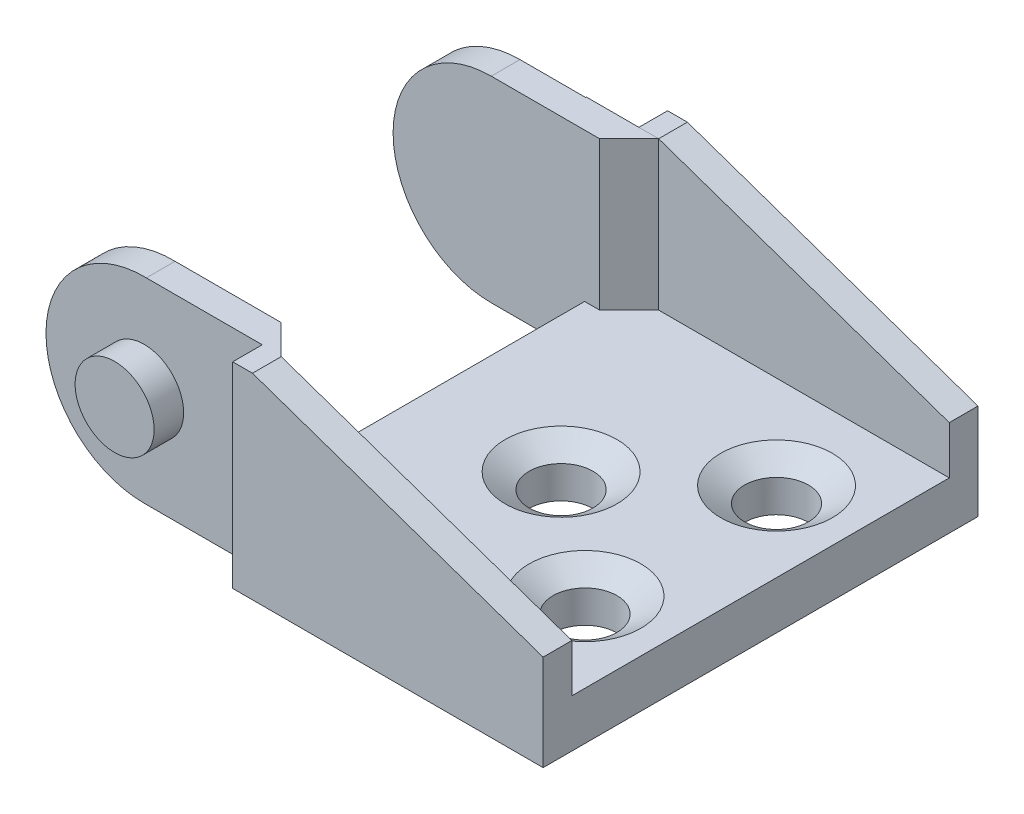
ISO-10303-21;
HEADER;
FILE_DESCRIPTION(('STEP AP214'),'2;1');
FILE_NAME('part.step','',(''),(''),'','','');
FILE_SCHEMA(('AUTOMOTIVE_DESIGN { 1 0 10303 214 1 1 1 1 }'));
ENDSEC;
DATA;
#1=APPLICATION_CONTEXT('core data for automotive mechanical design processes');
#2=APPLICATION_PROTOCOL_DEFINITION('international standard','automotive_design',2000,#1);
#3=PRODUCT_CONTEXT('',#1,'mechanical');
#4=PRODUCT('Part','Part','',(#3));
#5=PRODUCT_RELATED_PRODUCT_CATEGORY('part','',(#4));
#6=PRODUCT_DEFINITION_FORMATION('','',#4);
#7=PRODUCT_DEFINITION_CONTEXT('part definition',#1,'design');
#8=PRODUCT_DEFINITION('design','',#6,#7);
#9=PRODUCT_DEFINITION_SHAPE('','',#8);
#10=(LENGTH_UNIT() NAMED_UNIT(*) SI_UNIT(.MILLI.,.METRE.));
#11=(NAMED_UNIT(*) PLANE_ANGLE_UNIT() SI_UNIT($,.RADIAN.));
#12=(NAMED_UNIT(*) SI_UNIT($,.STERADIAN.) SOLID_ANGLE_UNIT());
#13=UNCERTAINTY_MEASURE_WITH_UNIT(LENGTH_MEASURE(1.E-05),#10,'distance_accuracy_value','');
#14=(GEOMETRIC_REPRESENTATION_CONTEXT(3) GLOBAL_UNCERTAINTY_ASSIGNED_CONTEXT((#13)) GLOBAL_UNIT_ASSIGNED_CONTEXT((#10,
#11,#12)) REPRESENTATION_CONTEXT('',''));
#15=CARTESIAN_POINT('',(0.,0.,0.));
#16=DIRECTION('',(0.,0.,1.));
#17=DIRECTION('',(1.,0.,0.));
#18=AXIS2_PLACEMENT_3D('',#15,#16,#17);
#19=CARTESIAN_POINT('',(6.15,6.15,-27.25));
#20=DIRECTION('',(0.,0.,1.));
#21=DIRECTION('',(1.,0.,0.));
#22=AXIS2_PLACEMENT_3D('',#19,#20,#21);
#23=CYLINDRICAL_SURFACE('',#22,6.15);
#24=DIRECTION('',(0.,0.,1.));
#25=VECTOR('',#24,1.);
#26=CARTESIAN_POINT('',(6.15,0.,-27.25));
#27=LINE('',#26,#25);
#28=CARTESIAN_POINT('',(6.15,0.,-3.65));
#29=VERTEX_POINT('',#28);
#30=CARTESIAN_POINT('',(6.15,0.,-1.85));
#31=VERTEX_POINT('',#30);
#32=EDGE_CURVE('E312',#29,#31,#27,.T.);
#33=ORIENTED_EDGE('',*,*,#32,.T.);
#34=CARTESIAN_POINT('',(6.15,6.15,-1.85));
#35=DIRECTION('',(0.,0.,1.));
#36=DIRECTION('',(1.,0.,0.));
#37=AXIS2_PLACEMENT_3D('',#34,#35,#36);
#38=CIRCLE('',#37,6.15);
#39=CARTESIAN_POINT('',(6.289600468625,12.298415381963,-1.85));
#40=VERTEX_POINT('',#39);
#41=EDGE_CURVE('E392',#31,#40,#38,.F.);
#42=ORIENTED_EDGE('',*,*,#41,.T.);
#43=DIRECTION('',(0.,0.,1.));
#44=VECTOR('',#43,1.);
#45=CARTESIAN_POINT('',(6.289600468625,12.298415381963,-27.25));
#46=LINE('',#45,#44);
#47=CARTESIAN_POINT('',(6.289600468625,12.298415381963,-3.65));
#48=VERTEX_POINT('',#47);
#49=EDGE_CURVE('E197',#48,#40,#46,.T.);
#50=ORIENTED_EDGE('',*,*,#49,.F.);
#51=CARTESIAN_POINT('',(6.15,6.15,-3.65));
#52=DIRECTION('',(0.,0.,-1.));
#53=DIRECTION('',(0.,1.,0.));
#54=AXIS2_PLACEMENT_3D('',#51,#52,#53);
#55=CIRCLE('',#54,6.15);
#56=EDGE_CURVE('E261',#29,#48,#55,.T.);
#57=ORIENTED_EDGE('',*,*,#56,.F.);
#58=EDGE_LOOP('',(#33,#42,#50,#57));
#59=FACE_BOUND('',#58,.T.);
#60=ADVANCED_FACE('F42',(#59),#23,.T.);
#61=DIRECTION('',(0.,0.,-1.));
#62=VECTOR('',#61,1.);
#63=CARTESIAN_POINT('',(6.15,12.3,-23.6));
#64=LINE('',#63,#62);
#65=CARTESIAN_POINT('',(6.15,12.3,-23.6));
#66=VERTEX_POINT('',#65);
#67=CARTESIAN_POINT('',(6.15,12.3,-25.4));
#68=VERTEX_POINT('',#67);
#69=EDGE_CURVE('E282',#66,#68,#64,.T.);
#70=ORIENTED_EDGE('',*,*,#69,.T.);
#71=CARTESIAN_POINT('',(6.15,6.15,-25.4));
#72=DIRECTION('',(0.,0.,-1.));
#73=DIRECTION('',(-1.,0.,0.));
#74=AXIS2_PLACEMENT_3D('',#71,#72,#73);
#75=CIRCLE('',#74,6.15);
#76=CARTESIAN_POINT('',(6.15,0.,-25.4));
#77=VERTEX_POINT('',#76);
#78=EDGE_CURVE('E245',#68,#77,#75,.F.);
#79=ORIENTED_EDGE('',*,*,#78,.T.);
#80=CARTESIAN_POINT('',(6.15,0.,-23.6));
#81=VERTEX_POINT('',#80);
#82=EDGE_CURVE('E325',#77,#81,#27,.T.);
#83=ORIENTED_EDGE('',*,*,#82,.T.);
#84=CARTESIAN_POINT('',(6.15,6.15,-23.6));
#85=DIRECTION('',(0.,0.,1.));
#86=DIRECTION('',(1.,0.,0.));
#87=AXIS2_PLACEMENT_3D('',#84,#85,#86);
#88=CIRCLE('',#87,6.15);
#89=EDGE_CURVE('E275',#66,#81,#88,.T.);
#90=ORIENTED_EDGE('',*,*,#89,.F.);
#91=EDGE_LOOP('',(#70,#79,#83,#90));
#92=FACE_BOUND('',#91,.T.);
#93=ADVANCED_FACE('F445',(#92),#23,.T.);
#94=CARTESIAN_POINT('',(33.,3.,-25.45));
#95=DIRECTION('',(0.,-1.,0.));
#96=DIRECTION('',(0.,0.,-1.));
#97=AXIS2_PLACEMENT_3D('',#94,#95,#96);
#98=PLANE('',#97);
#99=CARTESIAN_POINT('',(28.,3.,-7.625));
#100=DIRECTION('',(0.,-1.,0.));
#101=DIRECTION('',(0.,0.,-1.));
#102=AXIS2_PLACEMENT_3D('',#99,#100,#101);
#103=CIRCLE('',#102,3.5);
#104=CARTESIAN_POINT('',(28.,3.,-11.125));
#105=VERTEX_POINT('',#104);
#106=EDGE_CURVE('E372',#105,#105,#103,.T.);
#107=ORIENTED_EDGE('',*,*,#106,.T.);
#108=EDGE_LOOP('',(#107));
#109=FACE_BOUND('',#108,.T.);
#110=CARTESIAN_POINT('',(28.,3.,-19.625));
#111=DIRECTION('',(0.,-1.,0.));
#112=DIRECTION('',(0.,0.,-1.));
#113=AXIS2_PLACEMENT_3D('',#110,#111,#112);
#114=CIRCLE('',#113,3.5);
#115=CARTESIAN_POINT('',(28.,3.,-23.125));
#116=VERTEX_POINT('',#115);
#117=EDGE_CURVE('E369',#116,#116,#114,.T.);
#118=ORIENTED_EDGE('',*,*,#117,.T.);
#119=EDGE_LOOP('',(#118));
#120=FACE_BOUND('',#119,.T.);
#121=CARTESIAN_POINT('',(20.5,3.,-13.625));
#122=DIRECTION('',(0.,-1.,0.));
#123=DIRECTION('',(0.,0.,-1.));
#124=AXIS2_PLACEMENT_3D('',#121,#122,#123);
#125=CIRCLE('',#124,3.50000000000001);
#126=CARTESIAN_POINT('',(20.5,3.,-17.125));
#127=VERTEX_POINT('',#126);
#128=EDGE_CURVE('E366',#127,#127,#125,.T.);
#129=ORIENTED_EDGE('',*,*,#128,.T.);
#130=EDGE_LOOP('',(#129));
#131=FACE_BOUND('',#130,.T.);
#132=DIRECTION('',(1.,0.,0.));
#133=VECTOR('',#132,1.);
#134=CARTESIAN_POINT('',(33.,3.,-3.65));
#135=LINE('',#134,#133);
#136=CARTESIAN_POINT('',(12.,3.,-3.65));
#137=VERTEX_POINT('',#136);
#138=CARTESIAN_POINT('',(12.939600468625,3.,-3.65));
#139=VERTEX_POINT('',#138);
#140=EDGE_CURVE('E267',#137,#139,#135,.T.);
#141=ORIENTED_EDGE('',*,*,#140,.T.);
#142=DIRECTION('',(0.707106781186545,0.,0.70710678118655));
#143=VECTOR('',#142,1.);
#144=CARTESIAN_POINT('',(12.0698002343124,3.,-4.51980023431259));
#145=LINE('',#144,#143);
#146=CARTESIAN_POINT('',(14.789600468625,3.,-1.8));
#147=VERTEX_POINT('',#146);
#148=EDGE_CURVE('E51',#139,#147,#145,.T.);
#149=ORIENTED_EDGE('',*,*,#148,.T.);
#150=DIRECTION('',(-1.,0.,0.));
#151=VECTOR('',#150,1.);
#152=CARTESIAN_POINT('',(33.,3.,-1.8));
#153=LINE('',#152,#151);
#154=CARTESIAN_POINT('',(33.,3.,-1.8));
#155=VERTEX_POINT('',#154);
#156=EDGE_CURVE('E349',#155,#147,#153,.T.);
#157=ORIENTED_EDGE('',*,*,#156,.F.);
#158=DIRECTION('',(0.,0.,1.));
#159=VECTOR('',#158,1.);
#160=CARTESIAN_POINT('',(33.,3.,-25.45));
#161=LINE('',#160,#159);
#162=CARTESIAN_POINT('',(33.,3.,-25.45));
#163=VERTEX_POINT('',#162);
#164=EDGE_CURVE('E344',#163,#155,#161,.T.);
#165=ORIENTED_EDGE('',*,*,#164,.F.);
#166=DIRECTION('',(-1.,0.,0.));
#167=VECTOR('',#166,1.);
#168=CARTESIAN_POINT('',(33.,3.,-25.45));
#169=LINE('',#168,#167);
#170=CARTESIAN_POINT('',(14.789600468625,3.,-25.45));
#171=VERTEX_POINT('',#170);
#172=EDGE_CURVE('E352',#163,#171,#169,.T.);
#173=ORIENTED_EDGE('',*,*,#172,.T.);
#174=DIRECTION('',(-0.707106781186545,0.,0.70710678118655));
#175=VECTOR('',#174,1.);
#176=CARTESIAN_POINT('',(23.8948002343124,3.,-34.5551997656875));
#177=LINE('',#176,#175);
#178=CARTESIAN_POINT('',(12.939600468625,3.,-23.6));
#179=VERTEX_POINT('',#178);
#180=EDGE_CURVE('E12',#171,#179,#177,.T.);
#181=ORIENTED_EDGE('',*,*,#180,.T.);
#182=DIRECTION('',(-1.,0.,0.));
#183=VECTOR('',#182,1.);
#184=CARTESIAN_POINT('',(33.,3.,-23.6));
#185=LINE('',#184,#183);
#186=CARTESIAN_POINT('',(12.,3.,-23.6));
#187=VERTEX_POINT('',#186);
#188=EDGE_CURVE('E288',#179,#187,#185,.T.);
#189=ORIENTED_EDGE('',*,*,#188,.T.);
#190=DIRECTION('',(0.,0.,-1.));
#191=VECTOR('',#190,1.);
#192=CARTESIAN_POINT('',(12.,3.,-25.45));
#193=LINE('',#192,#191);
#194=EDGE_CURVE('E294',#137,#187,#193,.T.);
#195=ORIENTED_EDGE('',*,*,#194,.F.);
#196=EDGE_LOOP('',(#141,#149,#157,#165,#173,#181,#189,#195));
#197=FACE_BOUND('',#196,.T.);
#198=ADVANCED_FACE('F402',(#109,#120,#131,#197),#98,.F.);
#199=CARTESIAN_POINT('',(33.,3.,-1.8));
#200=DIRECTION('',(0.,0.,1.));
#201=DIRECTION('',(0.,-1.,0.));
#202=AXIS2_PLACEMENT_3D('',#199,#200,#201);
#203=PLANE('',#202);
#204=DIRECTION('',(0.,-1.,0.));
#205=VECTOR('',#204,1.);
#206=CARTESIAN_POINT('',(14.789600468625,0.,-1.8));
#207=LINE('',#206,#205);
#208=CARTESIAN_POINT('',(14.789600468625,12.3,-1.8));
#209=VERTEX_POINT('',#208);
#210=EDGE_CURVE('E257',#209,#147,#207,.T.);
#211=ORIENTED_EDGE('',*,*,#210,.F.);
#212=DIRECTION('',(-0.945043806505376,0.326943731834439,0.));
#213=VECTOR('',#212,1.);
#214=CARTESIAN_POINT('',(33.9269284465377,5.67932338864251,-1.8));
#215=LINE('',#214,#213);
#216=CARTESIAN_POINT('',(33.,6.,-1.8));
#217=VERTEX_POINT('',#216);
#218=EDGE_CURVE('E317',#217,#209,#215,.T.);
#219=ORIENTED_EDGE('',*,*,#218,.F.);
#220=DIRECTION('',(0.,1.,0.));
#221=VECTOR('',#220,1.);
#222=CARTESIAN_POINT('',(33.,3.,-1.8));
#223=LINE('',#222,#221);
#224=EDGE_CURVE('E346',#155,#217,#223,.T.);
#225=ORIENTED_EDGE('',*,*,#224,.F.);
#226=ORIENTED_EDGE('',*,*,#156,.T.);
#227=EDGE_LOOP('',(#211,#219,#225,#226));
#228=FACE_BOUND('',#227,.T.);
#229=ADVANCED_FACE('F409',(#228),#203,.F.);
#230=CARTESIAN_POINT('',(33.,12.3,-25.45));
#231=DIRECTION('',(0.,0.,-1.));
#232=DIRECTION('',(-1.,0.,0.));
#233=AXIS2_PLACEMENT_3D('',#230,#231,#232);
#234=PLANE('',#233);
#235=DIRECTION('',(0.,1.,0.));
#236=VECTOR('',#235,1.);
#237=CARTESIAN_POINT('',(14.789600468625,12.3,-25.45));
#238=LINE('',#237,#236);
#239=CARTESIAN_POINT('',(14.789600468625,12.3,-25.45));
#240=VERTEX_POINT('',#239);
#241=EDGE_CURVE('E272',#171,#240,#238,.T.);
#242=ORIENTED_EDGE('',*,*,#241,.F.);
#243=ORIENTED_EDGE('',*,*,#172,.F.);
#244=DIRECTION('',(0.,-1.,0.));
#245=VECTOR('',#244,1.);
#246=CARTESIAN_POINT('',(33.,12.3,-25.45));
#247=LINE('',#246,#245);
#248=CARTESIAN_POINT('',(33.,6.,-25.45));
#249=VERTEX_POINT('',#248);
#250=EDGE_CURVE('E342',#249,#163,#247,.T.);
#251=ORIENTED_EDGE('',*,*,#250,.F.);
#252=DIRECTION('',(0.945043806505376,-0.326943731834439,0.));
#253=VECTOR('',#252,1.);
#254=CARTESIAN_POINT('',(31.0534502622709,6.67342088385073,-25.45));
#255=LINE('',#254,#253);
#256=EDGE_CURVE('E329',#240,#249,#255,.T.);
#257=ORIENTED_EDGE('',*,*,#256,.F.);
#258=EDGE_LOOP('',(#242,#243,#251,#257));
#259=FACE_BOUND('',#258,.T.);
#260=ADVANCED_FACE('F479',(#259),#234,.F.);
#261=CARTESIAN_POINT('',(33.,12.3,0.));
#262=DIRECTION('',(0.,0.,-1.));
#263=DIRECTION('',(0.,1.,0.));
#264=AXIS2_PLACEMENT_3D('',#261,#262,#263);
#265=PLANE('',#264);
#266=DIRECTION('',(-0.999999982622739,-0.00018642564816779,0.));
#267=VECTOR('',#266,1.);
#268=CARTESIAN_POINT('',(6.289600468625,12.298415381963,0.));
#269=LINE('',#268,#267);
#270=CARTESIAN_POINT('',(14.789600468625,12.3,0.));
#271=VERTEX_POINT('',#270);
#272=CARTESIAN_POINT('',(13.5500000042183,12.2997689066759,0.));
#273=VERTEX_POINT('',#272);
#274=EDGE_CURVE('E309',#271,#273,#269,.T.);
#275=ORIENTED_EDGE('',*,*,#274,.T.);
#276=DIRECTION('',(0.000102412438478702,0.999999994755846,0.));
#277=VECTOR('',#276,1.);
#278=CARTESIAN_POINT('',(13.5500000042183,12.2997689066759,0.));
#279=LINE('',#278,#277);
#280=CARTESIAN_POINT('',(13.5487403548852,0.,0.));
#281=VERTEX_POINT('',#280);
#282=EDGE_CURVE('E210',#281,#273,#279,.T.);
#283=ORIENTED_EDGE('',*,*,#282,.F.);
#284=DIRECTION('',(-1.,0.,0.));
#285=VECTOR('',#284,1.);
#286=CARTESIAN_POINT('',(33.,0.,0.));
#287=LINE('',#286,#285);
#288=CARTESIAN_POINT('',(33.,0.,0.));
#289=VERTEX_POINT('',#288);
#290=EDGE_CURVE('E357',#289,#281,#287,.T.);
#291=ORIENTED_EDGE('',*,*,#290,.F.);
#292=DIRECTION('',(0.,-1.,0.));
#293=VECTOR('',#292,1.);
#294=CARTESIAN_POINT('',(33.,12.3,0.));
#295=LINE('',#294,#293);
#296=CARTESIAN_POINT('',(33.,6.,0.));
#297=VERTEX_POINT('',#296);
#298=EDGE_CURVE('E335',#297,#289,#295,.T.);
#299=ORIENTED_EDGE('',*,*,#298,.F.);
#300=DIRECTION('',(-0.945043806505376,0.326943731834439,0.));
#301=VECTOR('',#300,1.);
#302=CARTESIAN_POINT('',(14.789600468625,12.3,0.));
#303=LINE('',#302,#301);
#304=EDGE_CURVE('E302',#297,#271,#303,.T.);
#305=ORIENTED_EDGE('',*,*,#304,.T.);
#306=EDGE_LOOP('',(#275,#283,#291,#299,#305));
#307=FACE_BOUND('',#306,.T.);
#308=ADVANCED_FACE('F426',(#307),#265,.F.);
#309=CARTESIAN_POINT('',(33.,0.,0.));
#310=DIRECTION('',(0.,1.,0.));
#311=DIRECTION('',(0.,0.,1.));
#312=AXIS2_PLACEMENT_3D('',#309,#310,#311);
#313=PLANE('',#312);
#314=ORIENTED_EDGE('',*,*,#290,.T.);
#315=DIRECTION('',(0.,0.,1.));
#316=VECTOR('',#315,1.);
#317=CARTESIAN_POINT('',(13.5487403548852,0.,-1.85));
#318=LINE('',#317,#316);
#319=CARTESIAN_POINT('',(13.5487403548852,0.,-1.85));
#320=VERTEX_POINT('',#319);
#321=EDGE_CURVE('E203',#320,#281,#318,.T.);
#322=ORIENTED_EDGE('',*,*,#321,.F.);
#323=DIRECTION('',(1.,0.,0.));
#324=VECTOR('',#323,1.);
#325=CARTESIAN_POINT('',(10.2655194125093,0.,-1.85));
#326=LINE('',#325,#324);
#327=EDGE_CURVE('E211',#31,#320,#326,.T.);
#328=ORIENTED_EDGE('',*,*,#327,.F.);
#329=ORIENTED_EDGE('',*,*,#32,.F.);
#330=DIRECTION('',(-1.,0.,0.));
#331=VECTOR('',#330,1.);
#332=CARTESIAN_POINT('',(6.15,0.,-3.65));
#333=LINE('',#332,#331);
#334=CARTESIAN_POINT('',(12.,0.,-3.65));
#335=VERTEX_POINT('',#334);
#336=EDGE_CURVE('E258',#335,#29,#333,.T.);
#337=ORIENTED_EDGE('',*,*,#336,.F.);
#338=DIRECTION('',(0.,0.,-1.));
#339=VECTOR('',#338,1.);
#340=CARTESIAN_POINT('',(12.,0.,-25.45));
#341=LINE('',#340,#339);
#342=CARTESIAN_POINT('',(12.,0.,-23.6));
#343=VERTEX_POINT('',#342);
#344=EDGE_CURVE('E300',#335,#343,#341,.T.);
#345=ORIENTED_EDGE('',*,*,#344,.T.);
#346=DIRECTION('',(1.,0.,0.));
#347=VECTOR('',#346,1.);
#348=CARTESIAN_POINT('',(14.789600468625,0.,-23.6));
#349=LINE('',#348,#347);
#350=EDGE_CURVE('E279',#81,#343,#349,.T.);
#351=ORIENTED_EDGE('',*,*,#350,.F.);
#352=ORIENTED_EDGE('',*,*,#82,.F.);
#353=DIRECTION('',(-1.,0.,0.));
#354=VECTOR('',#353,1.);
#355=CARTESIAN_POINT('',(10.2655194082886,0.,-25.4));
#356=LINE('',#355,#354);
#357=CARTESIAN_POINT('',(13.55,0.,-25.4));
#358=VERTEX_POINT('',#357);
#359=EDGE_CURVE('E238',#358,#77,#356,.T.);
#360=ORIENTED_EDGE('',*,*,#359,.F.);
#361=DIRECTION('',(0.,0.,-1.));
#362=VECTOR('',#361,1.);
#363=CARTESIAN_POINT('',(13.55,0.,-25.4));
#364=LINE('',#363,#362);
#365=CARTESIAN_POINT('',(13.55,0.,-27.25));
#366=VERTEX_POINT('',#365);
#367=EDGE_CURVE('E242',#358,#366,#364,.T.);
#368=ORIENTED_EDGE('',*,*,#367,.T.);
#369=DIRECTION('',(-1.,0.,0.));
#370=VECTOR('',#369,1.);
#371=CARTESIAN_POINT('',(33.,0.,-27.25));
#372=LINE('',#371,#370);
#373=CARTESIAN_POINT('',(33.,0.,-27.25));
#374=VERTEX_POINT('',#373);
#375=EDGE_CURVE('E354',#374,#366,#372,.T.);
#376=ORIENTED_EDGE('',*,*,#375,.F.);
#377=DIRECTION('',(0.,0.,-1.));
#378=VECTOR('',#377,1.);
#379=CARTESIAN_POINT('',(33.,0.,0.));
#380=LINE('',#379,#378);
#381=EDGE_CURVE('E337',#289,#374,#380,.T.);
#382=ORIENTED_EDGE('',*,*,#381,.F.);
#383=EDGE_LOOP('',(#314,#322,#328,#329,#337,#345,#351,#352,#360,#368,#376,#382));
#384=FACE_BOUND('',#383,.T.);
#385=CARTESIAN_POINT('',(28.,0.,-19.625));
#386=DIRECTION('',(0.,1.,0.));
#387=DIRECTION('',(0.,0.,1.));
#388=AXIS2_PLACEMENT_3D('',#385,#386,#387);
#389=CIRCLE('',#388,2.);
#390=CARTESIAN_POINT('',(28.,0.,-17.625));
#391=VERTEX_POINT('',#390);
#392=EDGE_CURVE('E291',#391,#391,#389,.T.);
#393=ORIENTED_EDGE('',*,*,#392,.T.);
#394=EDGE_LOOP('',(#393));
#395=FACE_BOUND('',#394,.T.);
#396=CARTESIAN_POINT('',(28.,0.,-7.625));
#397=DIRECTION('',(0.,1.,0.));
#398=DIRECTION('',(0.,0.,1.));
#399=AXIS2_PLACEMENT_3D('',#396,#397,#398);
#400=CIRCLE('',#399,2.);
#401=CARTESIAN_POINT('',(28.,0.,-5.62500000000001));
#402=VERTEX_POINT('',#401);
#403=EDGE_CURVE('E295',#402,#402,#400,.T.);
#404=ORIENTED_EDGE('',*,*,#403,.T.);
#405=EDGE_LOOP('',(#404));
#406=FACE_BOUND('',#405,.T.);
#407=CARTESIAN_POINT('',(20.5,0.,-13.625));
#408=DIRECTION('',(0.,1.,0.));
#409=DIRECTION('',(0.,0.,1.));
#410=AXIS2_PLACEMENT_3D('',#407,#408,#409);
#411=CIRCLE('',#410,2.);
#412=CARTESIAN_POINT('',(20.5,0.,-11.625));
#413=VERTEX_POINT('',#412);
#414=EDGE_CURVE('E290',#413,#413,#411,.T.);
#415=ORIENTED_EDGE('',*,*,#414,.T.);
#416=EDGE_LOOP('',(#415));
#417=FACE_BOUND('',#416,.T.);
#418=ADVANCED_FACE('F420',(#384,#395,#406,#417),#313,.F.);
#419=CARTESIAN_POINT('',(33.,0.,-27.25));
#420=DIRECTION('',(0.,0.,1.));
#421=DIRECTION('',(1.,0.,0.));
#422=AXIS2_PLACEMENT_3D('',#419,#420,#421);
#423=PLANE('',#422);
#424=ORIENTED_EDGE('',*,*,#375,.T.);
#425=DIRECTION('',(0.,-1.,0.));
#426=VECTOR('',#425,1.);
#427=CARTESIAN_POINT('',(13.55,0.,-27.25));
#428=LINE('',#427,#426);
#429=CARTESIAN_POINT('',(13.55,12.2997689066751,-27.25));
#430=VERTEX_POINT('',#429);
#431=EDGE_CURVE('E227',#430,#366,#428,.T.);
#432=ORIENTED_EDGE('',*,*,#431,.F.);
#433=DIRECTION('',(-0.999999982622739,-0.00018642564816779,0.));
#434=VECTOR('',#433,1.);
#435=CARTESIAN_POINT('',(6.289600468625,12.298415381963,-27.25));
#436=LINE('',#435,#434);
#437=CARTESIAN_POINT('',(14.789600468625,12.3,-27.25));
#438=VERTEX_POINT('',#437);
#439=EDGE_CURVE('E308',#438,#430,#436,.T.);
#440=ORIENTED_EDGE('',*,*,#439,.F.);
#441=DIRECTION('',(-0.945043806505376,0.326943731834439,0.));
#442=VECTOR('',#441,1.);
#443=CARTESIAN_POINT('',(14.789600468625,12.3,-27.25));
#444=LINE('',#443,#442);
#445=CARTESIAN_POINT('',(33.,6.,-27.25));
#446=VERTEX_POINT('',#445);
#447=EDGE_CURVE('E305',#446,#438,#444,.T.);
#448=ORIENTED_EDGE('',*,*,#447,.F.);
#449=DIRECTION('',(0.,1.,0.));
#450=VECTOR('',#449,1.);
#451=CARTESIAN_POINT('',(33.,0.,-27.25));
#452=LINE('',#451,#450);
#453=EDGE_CURVE('E339',#374,#446,#452,.T.);
#454=ORIENTED_EDGE('',*,*,#453,.F.);
#455=EDGE_LOOP('',(#424,#432,#440,#448,#454));
#456=FACE_BOUND('',#455,.T.);
#457=ADVANCED_FACE('F476',(#456),#423,.F.);
#458=CARTESIAN_POINT('',(33.,0.,0.));
#459=DIRECTION('',(1.,0.,0.));
#460=DIRECTION('',(0.,0.,-1.));
#461=AXIS2_PLACEMENT_3D('',#458,#459,#460);
#462=PLANE('',#461);
#463=ORIENTED_EDGE('',*,*,#453,.T.);
#464=DIRECTION('',(0.,0.,1.));
#465=VECTOR('',#464,1.);
#466=CARTESIAN_POINT('',(33.,6.,-27.25));
#467=LINE('',#466,#465);
#468=EDGE_CURVE('E322',#446,#249,#467,.T.);
#469=ORIENTED_EDGE('',*,*,#468,.T.);
#470=ORIENTED_EDGE('',*,*,#250,.T.);
#471=ORIENTED_EDGE('',*,*,#164,.T.);
#472=ORIENTED_EDGE('',*,*,#224,.T.);
#473=DIRECTION('',(0.,0.,1.));
#474=VECTOR('',#473,1.);
#475=CARTESIAN_POINT('',(33.,6.,0.));
#476=LINE('',#475,#474);
#477=EDGE_CURVE('E360',#217,#297,#476,.T.);
#478=ORIENTED_EDGE('',*,*,#477,.T.);
#479=ORIENTED_EDGE('',*,*,#298,.T.);
#480=ORIENTED_EDGE('',*,*,#381,.T.);
#481=EDGE_LOOP('',(#463,#469,#470,#471,#472,#478,#479,#480));
#482=FACE_BOUND('',#481,.T.);
#483=ADVANCED_FACE('F431',(#482),#462,.T.);
#484=CARTESIAN_POINT('',(6.289600468625,12.298415381963,-27.25));
#485=DIRECTION('',(-0.00018642564816779,0.999999982622739,0.));
#486=DIRECTION('',(-0.999999982622739,-0.00018642564816779,0.));
#487=AXIS2_PLACEMENT_3D('',#484,#485,#486);
#488=PLANE('',#487);
#489=DIRECTION('',(0.,0.,-1.));
#490=VECTOR('',#489,1.);
#491=CARTESIAN_POINT('',(13.55,12.2997689066751,-25.4));
#492=LINE('',#491,#490);
#493=CARTESIAN_POINT('',(13.55,12.2997689066751,-25.45));
#494=VERTEX_POINT('',#493);
#495=EDGE_CURVE('E249',#494,#430,#492,.T.);
#496=ORIENTED_EDGE('',*,*,#495,.F.);
#497=DIRECTION('',(0.999999982622739,0.00018642564816779,0.));
#498=VECTOR('',#497,1.);
#499=CARTESIAN_POINT('',(32.9999993671063,12.303394885477,-25.45));
#500=LINE('',#499,#498);
#501=EDGE_CURVE('E331',#494,#240,#500,.T.);
#502=ORIENTED_EDGE('',*,*,#501,.T.);
#503=DIRECTION('',(0.,0.,1.));
#504=VECTOR('',#503,1.);
#505=CARTESIAN_POINT('',(14.789600468625,12.3,-27.25));
#506=LINE('',#505,#504);
#507=EDGE_CURVE('E318',#438,#240,#506,.T.);
#508=ORIENTED_EDGE('',*,*,#507,.F.);
#509=ORIENTED_EDGE('',*,*,#439,.T.);
#510=EDGE_LOOP('',(#496,#502,#508,#509));
#511=FACE_BOUND('',#510,.T.);
#512=ADVANCED_FACE('F475',(#511),#488,.T.);
#513=EDGE_CURVE('E321',#209,#271,#506,.T.);
#514=ORIENTED_EDGE('',*,*,#513,.F.);
#515=DIRECTION('',(-0.707106775042755,-0.000131822841151902,-0.70710677504276));
#516=VECTOR('',#515,1.);
#517=CARTESIAN_POINT('',(-2.18539938410268,12.2968354245948,-18.7749998527278));
#518=LINE('',#517,#516);
#519=CARTESIAN_POINT('',(12.939600468625,12.2996551125449,-3.65));
#520=VERTEX_POINT('',#519);
#521=EDGE_CURVE('E397',#209,#520,#518,.T.);
#522=ORIENTED_EDGE('',*,*,#521,.T.);
#523=DIRECTION('',(0.999999982622739,0.00018642564816779,0.));
#524=VECTOR('',#523,1.);
#525=CARTESIAN_POINT('',(14.789600468625,12.3,-3.65));
#526=LINE('',#525,#524);
#527=EDGE_CURVE('E264',#48,#520,#526,.T.);
#528=ORIENTED_EDGE('',*,*,#527,.F.);
#529=ORIENTED_EDGE('',*,*,#49,.T.);
#530=DIRECTION('',(0.999999982622739,0.00018642564816779,0.));
#531=VECTOR('',#530,1.);
#532=CARTESIAN_POINT('',(6.289600468625,12.298415381963,-1.85));
#533=LINE('',#532,#531);
#534=CARTESIAN_POINT('',(13.5500000042183,12.2997689066759,-1.85));
#535=VERTEX_POINT('',#534);
#536=EDGE_CURVE('E189',#40,#535,#533,.T.);
#537=ORIENTED_EDGE('',*,*,#536,.T.);
#538=DIRECTION('',(0.,0.,1.));
#539=VECTOR('',#538,1.);
#540=CARTESIAN_POINT('',(13.5500000042183,12.2997689066759,-1.85));
#541=LINE('',#540,#539);
#542=EDGE_CURVE('E194',#535,#273,#541,.T.);
#543=ORIENTED_EDGE('',*,*,#542,.T.);
#544=ORIENTED_EDGE('',*,*,#274,.F.);
#545=EDGE_LOOP('',(#514,#522,#528,#529,#537,#543,#544));
#546=FACE_BOUND('',#545,.T.);
#547=ADVANCED_FACE('F192',(#546),#488,.T.);
#548=CARTESIAN_POINT('',(14.789600468625,12.3,-27.25));
#549=DIRECTION('',(0.326943731834439,0.945043806505376,0.));
#550=DIRECTION('',(-0.945043806505376,0.326943731834439,0.));
#551=AXIS2_PLACEMENT_3D('',#548,#549,#550);
#552=PLANE('',#551);
#553=ORIENTED_EDGE('',*,*,#256,.T.);
#554=ORIENTED_EDGE('',*,*,#468,.F.);
#555=ORIENTED_EDGE('',*,*,#447,.T.);
#556=ORIENTED_EDGE('',*,*,#507,.T.);
#557=EDGE_LOOP('',(#553,#554,#555,#556));
#558=FACE_BOUND('',#557,.T.);
#559=ADVANCED_FACE('F463',(#558),#552,.T.);
#560=ORIENTED_EDGE('',*,*,#218,.T.);
#561=ORIENTED_EDGE('',*,*,#513,.T.);
#562=ORIENTED_EDGE('',*,*,#304,.F.);
#563=ORIENTED_EDGE('',*,*,#477,.F.);
#564=EDGE_LOOP('',(#560,#561,#562,#563));
#565=FACE_BOUND('',#564,.T.);
#566=ADVANCED_FACE('F429',(#565),#552,.T.);
#567=CARTESIAN_POINT('',(12.,0.,-25.45));
#568=DIRECTION('',(1.,0.,0.));
#569=DIRECTION('',(0.,0.,-1.));
#570=AXIS2_PLACEMENT_3D('',#567,#568,#569);
#571=PLANE('',#570);
#572=ORIENTED_EDGE('',*,*,#344,.F.);
#573=DIRECTION('',(0.,1.,0.));
#574=VECTOR('',#573,1.);
#575=CARTESIAN_POINT('',(12.,0.,-3.65));
#576=LINE('',#575,#574);
#577=EDGE_CURVE('E384',#335,#137,#576,.T.);
#578=ORIENTED_EDGE('',*,*,#577,.T.);
#579=ORIENTED_EDGE('',*,*,#194,.T.);
#580=DIRECTION('',(0.,-1.,0.));
#581=VECTOR('',#580,1.);
#582=CARTESIAN_POINT('',(12.,0.,-23.6));
#583=LINE('',#582,#581);
#584=EDGE_CURVE('E381',#187,#343,#583,.T.);
#585=ORIENTED_EDGE('',*,*,#584,.T.);
#586=EDGE_LOOP('',(#572,#578,#579,#585));
#587=FACE_BOUND('',#586,.T.);
#588=ADVANCED_FACE('F450',(#587),#571,.F.);
#589=CARTESIAN_POINT('',(20.5,0.,-13.625));
#590=DIRECTION('',(0.,1.,0.));
#591=DIRECTION('',(0.,0.,1.));
#592=AXIS2_PLACEMENT_3D('',#589,#590,#591);
#593=CYLINDRICAL_SURFACE('',#592,2.);
#594=CARTESIAN_POINT('',(20.5,2.02588861020373,-13.625));
#595=DIRECTION('',(0.,-1.,0.));
#596=DIRECTION('',(0.,0.,-1.));
#597=AXIS2_PLACEMENT_3D('',#594,#595,#596);
#598=CIRCLE('',#597,2.);
#599=CARTESIAN_POINT('',(20.5,2.02588861020373,-15.625));
#600=VERTEX_POINT('',#599);
#601=EDGE_CURVE('E378',#600,#600,#598,.F.);
#602=ORIENTED_EDGE('',*,*,#601,.T.);
#603=EDGE_LOOP('',(#602));
#604=FACE_BOUND('',#603,.T.);
#605=ORIENTED_EDGE('',*,*,#414,.F.);
#606=EDGE_LOOP('',(#605));
#607=FACE_BOUND('',#606,.T.);
#608=ADVANCED_FACE('F452',(#604,#607),#593,.F.);
#609=CARTESIAN_POINT('',(28.,0.,-7.625));
#610=DIRECTION('',(0.,1.,0.));
#611=DIRECTION('',(0.,0.,1.));
#612=AXIS2_PLACEMENT_3D('',#609,#610,#611);
#613=CYLINDRICAL_SURFACE('',#612,2.);
#614=CARTESIAN_POINT('',(28.,2.02588861020374,-7.625));
#615=DIRECTION('',(0.,-1.,0.));
#616=DIRECTION('',(0.,0.,-1.));
#617=AXIS2_PLACEMENT_3D('',#614,#615,#616);
#618=CIRCLE('',#617,2.);
#619=CARTESIAN_POINT('',(28.,2.02588861020375,-9.625));
#620=VERTEX_POINT('',#619);
#621=EDGE_CURVE('E363',#620,#620,#618,.F.);
#622=ORIENTED_EDGE('',*,*,#621,.T.);
#623=EDGE_LOOP('',(#622));
#624=FACE_BOUND('',#623,.T.);
#625=ORIENTED_EDGE('',*,*,#403,.F.);
#626=EDGE_LOOP('',(#625));
#627=FACE_BOUND('',#626,.T.);
#628=ADVANCED_FACE('F459',(#624,#627),#613,.F.);
#629=CARTESIAN_POINT('',(28.,0.,-19.625));
#630=DIRECTION('',(0.,1.,0.));
#631=DIRECTION('',(0.,0.,1.));
#632=AXIS2_PLACEMENT_3D('',#629,#630,#631);
#633=CYLINDRICAL_SURFACE('',#632,2.);
#634=CARTESIAN_POINT('',(28.,2.02588861020374,-19.625));
#635=DIRECTION('',(0.,-1.,0.));
#636=DIRECTION('',(0.,0.,-1.));
#637=AXIS2_PLACEMENT_3D('',#634,#635,#636);
#638=CIRCLE('',#637,2.);
#639=CARTESIAN_POINT('',(28.,2.02588861020374,-21.625));
#640=VERTEX_POINT('',#639);
#641=EDGE_CURVE('E375',#640,#640,#638,.F.);
#642=ORIENTED_EDGE('',*,*,#641,.T.);
#643=EDGE_LOOP('',(#642));
#644=FACE_BOUND('',#643,.T.);
#645=ORIENTED_EDGE('',*,*,#392,.F.);
#646=EDGE_LOOP('',(#645));
#647=FACE_BOUND('',#646,.T.);
#648=ADVANCED_FACE('F501',(#644,#647),#633,.F.);
#649=CARTESIAN_POINT('',(28.,2.02588861020374,-7.625));
#650=DIRECTION('',(0.,1.,0.));
#651=DIRECTION('',(0.,0.,1.));
#652=AXIS2_PLACEMENT_3D('',#649,#650,#651);
#653=CONICAL_SURFACE('',#652,2.,0.99483767363677);
#654=ORIENTED_EDGE('',*,*,#106,.F.);
#655=EDGE_LOOP('',(#654));
#656=FACE_BOUND('',#655,.T.);
#657=ORIENTED_EDGE('',*,*,#621,.F.);
#658=EDGE_LOOP('',(#657));
#659=FACE_BOUND('',#658,.T.);
#660=ADVANCED_FACE('F494',(#656,#659),#653,.F.);
#661=CARTESIAN_POINT('',(28.,2.02588861020374,-19.625));
#662=DIRECTION('',(0.,1.,0.));
#663=DIRECTION('',(0.,0.,1.));
#664=AXIS2_PLACEMENT_3D('',#661,#662,#663);
#665=CONICAL_SURFACE('',#664,2.,0.994837673636771);
#666=ORIENTED_EDGE('',*,*,#117,.F.);
#667=EDGE_LOOP('',(#666));
#668=FACE_BOUND('',#667,.T.);
#669=ORIENTED_EDGE('',*,*,#641,.F.);
#670=EDGE_LOOP('',(#669));
#671=FACE_BOUND('',#670,.T.);
#672=ADVANCED_FACE('F500',(#668,#671),#665,.F.);
#673=CARTESIAN_POINT('',(20.5,2.02588861020373,-13.625));
#674=DIRECTION('',(0.,1.,0.));
#675=DIRECTION('',(0.,0.,1.));
#676=AXIS2_PLACEMENT_3D('',#673,#674,#675);
#677=CONICAL_SURFACE('',#676,2.,0.99483767363677);
#678=ORIENTED_EDGE('',*,*,#128,.F.);
#679=EDGE_LOOP('',(#678));
#680=FACE_BOUND('',#679,.T.);
#681=ORIENTED_EDGE('',*,*,#601,.F.);
#682=EDGE_LOOP('',(#681));
#683=FACE_BOUND('',#682,.T.);
#684=ADVANCED_FACE('F508',(#680,#683),#677,.F.);
#685=CARTESIAN_POINT('',(6.15,6.15,-23.6));
#686=DIRECTION('',(0.,0.,1.));
#687=DIRECTION('',(1.,0.,0.));
#688=AXIS2_PLACEMENT_3D('',#685,#686,#687);
#689=PLANE('',#688);
#690=ORIENTED_EDGE('',*,*,#188,.F.);
#691=DIRECTION('',(0.,1.,0.));
#692=VECTOR('',#691,1.);
#693=CARTESIAN_POINT('',(12.939600468625,12.3,-23.6));
#694=LINE('',#693,#692);
#695=CARTESIAN_POINT('',(12.939600468625,12.3,-23.6));
#696=VERTEX_POINT('',#695);
#697=EDGE_CURVE('E399',#179,#696,#694,.T.);
#698=ORIENTED_EDGE('',*,*,#697,.T.);
#699=DIRECTION('',(-1.,0.,0.));
#700=VECTOR('',#699,1.);
#701=CARTESIAN_POINT('',(14.789600468625,12.3,-23.6));
#702=LINE('',#701,#700);
#703=EDGE_CURVE('E273',#696,#66,#702,.T.);
#704=ORIENTED_EDGE('',*,*,#703,.T.);
#705=ORIENTED_EDGE('',*,*,#89,.T.);
#706=ORIENTED_EDGE('',*,*,#350,.T.);
#707=ORIENTED_EDGE('',*,*,#584,.F.);
#708=EDGE_LOOP('',(#690,#698,#704,#705,#706,#707));
#709=FACE_BOUND('',#708,.T.);
#710=ADVANCED_FACE('F437',(#709),#689,.T.);
#711=CARTESIAN_POINT('',(6.15,6.15,-25.45));
#712=DIRECTION('',(0.,0.,1.));
#713=DIRECTION('',(1.,0.,0.));
#714=AXIS2_PLACEMENT_3D('',#711,#712,#713);
#715=PLANE('',#714);
#716=CARTESIAN_POINT('',(10.2667791146775,12.2991568300829,-25.45));
#717=VERTEX_POINT('',#716);
#718=EDGE_CURVE('E334',#717,#494,#500,.T.);
#719=ORIENTED_EDGE('',*,*,#718,.F.);
#720=CARTESIAN_POINT('',(6.15,6.15,-25.45));
#721=DIRECTION('',(0.,0.,1.));
#722=DIRECTION('',(1.,0.,0.));
#723=AXIS2_PLACEMENT_3D('',#720,#721,#722);
#724=CIRCLE('',#723,7.4);
#725=CARTESIAN_POINT('',(10.2655194082886,12.3,-25.45));
#726=VERTEX_POINT('',#725);
#727=EDGE_CURVE('E254',#717,#726,#724,.T.);
#728=ORIENTED_EDGE('',*,*,#727,.T.);
#729=DIRECTION('',(-1.,0.,0.));
#730=VECTOR('',#729,1.);
#731=CARTESIAN_POINT('',(14.789600468625,12.3,-25.45));
#732=LINE('',#731,#730);
#733=EDGE_CURVE('E276',#240,#726,#732,.T.);
#734=ORIENTED_EDGE('',*,*,#733,.F.);
#735=ORIENTED_EDGE('',*,*,#501,.F.);
#736=EDGE_LOOP('',(#719,#728,#734,#735));
#737=FACE_BOUND('',#736,.T.);
#738=ADVANCED_FACE('F566',(#737),#715,.F.);
#739=CARTESIAN_POINT('',(14.789600468625,12.3,-23.6));
#740=DIRECTION('',(0.,-1.,0.));
#741=DIRECTION('',(0.,0.,-1.));
#742=AXIS2_PLACEMENT_3D('',#739,#740,#741);
#743=PLANE('',#742);
#744=ORIENTED_EDGE('',*,*,#703,.F.);
#745=DIRECTION('',(0.707106781186545,0.,-0.70710678118655));
#746=VECTOR('',#745,1.);
#747=CARTESIAN_POINT('',(12.939600468625,12.3,-23.6));
#748=LINE('',#747,#746);
#749=EDGE_CURVE('E58',#696,#240,#748,.T.);
#750=ORIENTED_EDGE('',*,*,#749,.T.);
#751=ORIENTED_EDGE('',*,*,#733,.T.);
#752=DIRECTION('',(0.,0.,-1.));
#753=VECTOR('',#752,1.);
#754=CARTESIAN_POINT('',(10.2655194082886,12.3,-25.4));
#755=LINE('',#754,#753);
#756=CARTESIAN_POINT('',(10.2655194082886,12.3,-25.4));
#757=VERTEX_POINT('',#756);
#758=EDGE_CURVE('E389',#726,#757,#755,.F.);
#759=ORIENTED_EDGE('',*,*,#758,.T.);
#760=DIRECTION('',(1.,0.,0.));
#761=VECTOR('',#760,1.);
#762=CARTESIAN_POINT('',(14.789600468625,12.3,-25.4));
#763=LINE('',#762,#761);
#764=EDGE_CURVE('E387',#68,#757,#763,.T.);
#765=ORIENTED_EDGE('',*,*,#764,.F.);
#766=ORIENTED_EDGE('',*,*,#69,.F.);
#767=EDGE_LOOP('',(#744,#750,#751,#759,#765,#766));
#768=FACE_BOUND('',#767,.T.);
#769=ADVANCED_FACE('F441',(#768),#743,.F.);
#770=CARTESIAN_POINT('',(6.15,6.15,-3.65));
#771=DIRECTION('',(0.,0.,-1.));
#772=DIRECTION('',(0.,1.,0.));
#773=AXIS2_PLACEMENT_3D('',#770,#771,#772);
#774=PLANE('',#773);
#775=ORIENTED_EDGE('',*,*,#527,.T.);
#776=DIRECTION('',(0.,-1.,0.));
#777=VECTOR('',#776,1.);
#778=CARTESIAN_POINT('',(12.939600468625,3.,-3.65));
#779=LINE('',#778,#777);
#780=EDGE_CURVE('E394',#520,#139,#779,.T.);
#781=ORIENTED_EDGE('',*,*,#780,.T.);
#782=ORIENTED_EDGE('',*,*,#140,.F.);
#783=ORIENTED_EDGE('',*,*,#577,.F.);
#784=ORIENTED_EDGE('',*,*,#336,.T.);
#785=ORIENTED_EDGE('',*,*,#56,.T.);
#786=EDGE_LOOP('',(#775,#781,#782,#783,#784,#785));
#787=FACE_BOUND('',#786,.T.);
#788=ADVANCED_FACE('F414',(#787),#774,.T.);
#789=CARTESIAN_POINT('',(13.55,12.2997689066751,-25.4));
#790=DIRECTION('',(-0.000186425648167898,0.999999982622739,0.));
#791=DIRECTION('',(-0.999999982622739,-0.000186425648167898,0.));
#792=AXIS2_PLACEMENT_3D('',#789,#790,#791);
#793=PLANE('',#792);
#794=CARTESIAN_POINT('',(13.55,12.2997689066751,-25.4));
#795=VERTEX_POINT('',#794);
#796=EDGE_CURVE('E246',#795,#494,#492,.T.);
#797=ORIENTED_EDGE('',*,*,#796,.F.);
#798=DIRECTION('',(0.999999982622739,0.000186425648167898,0.));
#799=VECTOR('',#798,1.);
#800=CARTESIAN_POINT('',(13.55,12.2997689066751,-25.4));
#801=LINE('',#800,#799);
#802=CARTESIAN_POINT('',(10.2667791146775,12.2991568300829,-25.4));
#803=VERTEX_POINT('',#802);
#804=EDGE_CURVE('E232',#803,#795,#801,.T.);
#805=ORIENTED_EDGE('',*,*,#804,.F.);
#806=DIRECTION('',(0.,0.,-1.));
#807=VECTOR('',#806,1.);
#808=CARTESIAN_POINT('',(10.2667791146775,12.2991568300829,-25.4));
#809=LINE('',#808,#807);
#810=EDGE_CURVE('E240',#803,#717,#809,.T.);
#811=ORIENTED_EDGE('',*,*,#810,.T.);
#812=ORIENTED_EDGE('',*,*,#718,.T.);
#813=EDGE_LOOP('',(#797,#805,#811,#812));
#814=FACE_BOUND('',#813,.T.);
#815=ADVANCED_FACE('F556',(#814),#793,.F.);
#816=CARTESIAN_POINT('',(6.15,6.15,-25.4));
#817=DIRECTION('',(0.,0.,-1.));
#818=DIRECTION('',(-1.,0.,0.));
#819=AXIS2_PLACEMENT_3D('',#816,#817,#818);
#820=CYLINDRICAL_SURFACE('',#819,7.4);
#821=ORIENTED_EDGE('',*,*,#810,.F.);
#822=CARTESIAN_POINT('',(6.15,6.15,-25.4));
#823=DIRECTION('',(0.,0.,-1.));
#824=DIRECTION('',(-1.,0.,0.));
#825=AXIS2_PLACEMENT_3D('',#822,#823,#824);
#826=CIRCLE('',#825,7.4);
#827=EDGE_CURVE('E230',#757,#803,#826,.T.);
#828=ORIENTED_EDGE('',*,*,#827,.F.);
#829=ORIENTED_EDGE('',*,*,#758,.F.);
#830=ORIENTED_EDGE('',*,*,#727,.F.);
#831=EDGE_LOOP('',(#821,#828,#829,#830));
#832=FACE_BOUND('',#831,.T.);
#833=ADVANCED_FACE('F551',(#832),#820,.F.);
#834=CARTESIAN_POINT('',(6.15,6.15,-25.4));
#835=DIRECTION('',(0.,0.,-1.));
#836=DIRECTION('',(-1.,0.,0.));
#837=AXIS2_PLACEMENT_3D('',#834,#835,#836);
#838=PLANE('',#837);
#839=CARTESIAN_POINT('',(6.15,6.15,-25.4));
#840=DIRECTION('',(0.,0.,-1.));
#841=DIRECTION('',(-1.,0.,0.));
#842=AXIS2_PLACEMENT_3D('',#839,#840,#841);
#843=CIRCLE('',#842,2.5);
#844=CARTESIAN_POINT('',(3.65,6.15,-25.4));
#845=VERTEX_POINT('',#844);
#846=EDGE_CURVE('E224',#845,#845,#843,.T.);
#847=ORIENTED_EDGE('',*,*,#846,.F.);
#848=EDGE_LOOP('',(#847));
#849=FACE_BOUND('',#848,.T.);
#850=ORIENTED_EDGE('',*,*,#359,.T.);
#851=ORIENTED_EDGE('',*,*,#78,.F.);
#852=ORIENTED_EDGE('',*,*,#764,.T.);
#853=ORIENTED_EDGE('',*,*,#827,.T.);
#854=ORIENTED_EDGE('',*,*,#804,.T.);
#855=DIRECTION('',(0.,-1.,0.));
#856=VECTOR('',#855,1.);
#857=CARTESIAN_POINT('',(13.55,0.,-25.4));
#858=LINE('',#857,#856);
#859=EDGE_CURVE('E235',#795,#358,#858,.T.);
#860=ORIENTED_EDGE('',*,*,#859,.T.);
#861=EDGE_LOOP('',(#850,#851,#852,#853,#854,#860));
#862=FACE_BOUND('',#861,.T.);
#863=ADVANCED_FACE('F548',(#849,#862),#838,.T.);
#864=CARTESIAN_POINT('',(13.55,0.,-25.4));
#865=DIRECTION('',(1.,0.,0.));
#866=DIRECTION('',(0.,1.,0.));
#867=AXIS2_PLACEMENT_3D('',#864,#865,#866);
#868=PLANE('',#867);
#869=ORIENTED_EDGE('',*,*,#431,.T.);
#870=ORIENTED_EDGE('',*,*,#367,.F.);
#871=ORIENTED_EDGE('',*,*,#859,.F.);
#872=ORIENTED_EDGE('',*,*,#796,.T.);
#873=ORIENTED_EDGE('',*,*,#495,.T.);
#874=EDGE_LOOP('',(#869,#870,#871,#872,#873));
#875=FACE_BOUND('',#874,.T.);
#876=ADVANCED_FACE('F546',(#875),#868,.F.);
#877=CARTESIAN_POINT('',(6.15,6.15,-25.4));
#878=DIRECTION('',(0.,0.,-1.));
#879=DIRECTION('',(-1.,0.,0.));
#880=AXIS2_PLACEMENT_3D('',#877,#878,#879);
#881=CYLINDRICAL_SURFACE('',#880,2.5);
#882=ORIENTED_EDGE('',*,*,#846,.T.);
#883=EDGE_LOOP('',(#882));
#884=FACE_BOUND('',#883,.T.);
#885=CARTESIAN_POINT('',(6.15,6.15,-27.25));
#886=DIRECTION('',(0.,0.,-1.));
#887=DIRECTION('',(-1.,0.,0.));
#888=AXIS2_PLACEMENT_3D('',#885,#886,#887);
#889=CIRCLE('',#888,2.5);
#890=CARTESIAN_POINT('',(3.65,6.15,-27.25));
#891=VERTEX_POINT('',#890);
#892=EDGE_CURVE('E202',#891,#891,#889,.T.);
#893=ORIENTED_EDGE('',*,*,#892,.F.);
#894=EDGE_LOOP('',(#893));
#895=FACE_BOUND('',#894,.T.);
#896=ADVANCED_FACE('F541',(#884,#895),#881,.T.);
#897=ORIENTED_EDGE('',*,*,#892,.T.);
#898=EDGE_LOOP('',(#897));
#899=FACE_BOUND('',#898,.T.);
#900=ADVANCED_FACE('F488',(#899),#423,.F.);
#901=CARTESIAN_POINT('',(6.15,6.15,-1.85));
#902=DIRECTION('',(0.,0.,1.));
#903=DIRECTION('',(1.,0.,0.));
#904=AXIS2_PLACEMENT_3D('',#901,#902,#903);
#905=PLANE('',#904);
#906=CARTESIAN_POINT('',(6.15,6.15,-1.85));
#907=DIRECTION('',(0.,0.,1.));
#908=DIRECTION('',(1.,0.,0.));
#909=AXIS2_PLACEMENT_3D('',#906,#907,#908);
#910=CIRCLE('',#909,2.475);
#911=CARTESIAN_POINT('',(8.625,6.15,-1.85));
#912=VERTEX_POINT('',#911);
#913=EDGE_CURVE('E217',#912,#912,#910,.T.);
#914=ORIENTED_EDGE('',*,*,#913,.F.);
#915=EDGE_LOOP('',(#914));
#916=FACE_BOUND('',#915,.T.);
#917=ORIENTED_EDGE('',*,*,#41,.F.);
#918=ORIENTED_EDGE('',*,*,#327,.T.);
#919=DIRECTION('',(0.000102412438478702,0.999999994755846,0.));
#920=VECTOR('',#919,1.);
#921=CARTESIAN_POINT('',(13.5500000042183,12.2997689066759,-1.85));
#922=LINE('',#921,#920);
#923=EDGE_CURVE('E207',#320,#535,#922,.T.);
#924=ORIENTED_EDGE('',*,*,#923,.T.);
#925=ORIENTED_EDGE('',*,*,#536,.F.);
#926=EDGE_LOOP('',(#917,#918,#924,#925));
#927=FACE_BOUND('',#926,.T.);
#928=ADVANCED_FACE('F213',(#916,#927),#905,.T.);
#929=CARTESIAN_POINT('',(13.5500000042183,12.2997689066759,-1.85));
#930=DIRECTION('',(0.999999994755846,-0.000102412438478702,0.));
#931=DIRECTION('',(0.000102412438478702,0.999999994755846,0.));
#932=AXIS2_PLACEMENT_3D('',#929,#930,#931);
#933=PLANE('',#932);
#934=ORIENTED_EDGE('',*,*,#282,.T.);
#935=ORIENTED_EDGE('',*,*,#542,.F.);
#936=ORIENTED_EDGE('',*,*,#923,.F.);
#937=ORIENTED_EDGE('',*,*,#321,.T.);
#938=EDGE_LOOP('',(#934,#935,#936,#937));
#939=FACE_BOUND('',#938,.T.);
#940=ADVANCED_FACE('F206',(#939),#933,.F.);
#941=CARTESIAN_POINT('',(6.15,6.15,-1.85));
#942=DIRECTION('',(0.,0.,1.));
#943=DIRECTION('',(1.,0.,0.));
#944=AXIS2_PLACEMENT_3D('',#941,#942,#943);
#945=CYLINDRICAL_SURFACE('',#944,2.475);
#946=ORIENTED_EDGE('',*,*,#913,.T.);
#947=EDGE_LOOP('',(#946));
#948=FACE_BOUND('',#947,.T.);
#949=CARTESIAN_POINT('',(6.15,6.15,0.));
#950=DIRECTION('',(0.,0.,1.));
#951=DIRECTION('',(1.,0.,0.));
#952=AXIS2_PLACEMENT_3D('',#949,#950,#951);
#953=CIRCLE('',#952,2.475);
#954=CARTESIAN_POINT('',(8.625,6.15,0.));
#955=VERTEX_POINT('',#954);
#956=EDGE_CURVE('E220',#955,#955,#953,.T.);
#957=ORIENTED_EDGE('',*,*,#956,.F.);
#958=EDGE_LOOP('',(#957));
#959=FACE_BOUND('',#958,.T.);
#960=ADVANCED_FACE('F522',(#948,#959),#945,.T.);
#961=ORIENTED_EDGE('',*,*,#956,.T.);
#962=EDGE_LOOP('',(#961));
#963=FACE_BOUND('',#962,.T.);
#964=ADVANCED_FACE('F492',(#963),#265,.F.);
#965=CARTESIAN_POINT('',(12.939600468625,6.15,-3.65));
#966=DIRECTION('',(0.70710678118655,0.,-0.707106781186545));
#967=DIRECTION('',(0.,1.,0.));
#968=AXIS2_PLACEMENT_3D('',#965,#966,#967);
#969=PLANE('',#968);
#970=ORIENTED_EDGE('',*,*,#521,.F.);
#971=ORIENTED_EDGE('',*,*,#210,.T.);
#972=ORIENTED_EDGE('',*,*,#148,.F.);
#973=ORIENTED_EDGE('',*,*,#780,.F.);
#974=EDGE_LOOP('',(#970,#971,#972,#973));
#975=FACE_BOUND('',#974,.T.);
#976=ADVANCED_FACE('F412',(#975),#969,.T.);
#977=CARTESIAN_POINT('',(12.939600468625,6.15,-23.6));
#978=DIRECTION('',(0.70710678118655,0.,0.707106781186545));
#979=DIRECTION('',(0.,-1.,0.));
#980=AXIS2_PLACEMENT_3D('',#977,#978,#979);
#981=PLANE('',#980);
#982=ORIENTED_EDGE('',*,*,#180,.F.);
#983=ORIENTED_EDGE('',*,*,#241,.T.);
#984=ORIENTED_EDGE('',*,*,#749,.F.);
#985=ORIENTED_EDGE('',*,*,#697,.F.);
#986=EDGE_LOOP('',(#982,#983,#984,#985));
#987=FACE_BOUND('',#986,.T.);
#988=ADVANCED_FACE('F45',(#987),#981,.T.);
#989=CLOSED_SHELL('',(#60,#93,#198,#229,#260,#308,#418,#457,#483,#512,#547,#559,#566,#588,#608,
#628,#648,#660,#672,#684,#710,#738,#769,#788,#815,#833,#863,#876,#896,#900,#928,#940,#960,#964,
#976,#988));
#990=MANIFOLD_SOLID_BREP('B2',#989);
#991=ADVANCED_BREP_SHAPE_REPRESENTATION('',(#18,#990),#14);
#992=SHAPE_DEFINITION_REPRESENTATION(#9,#991);
ENDSEC;
END-ISO-10303-21;
